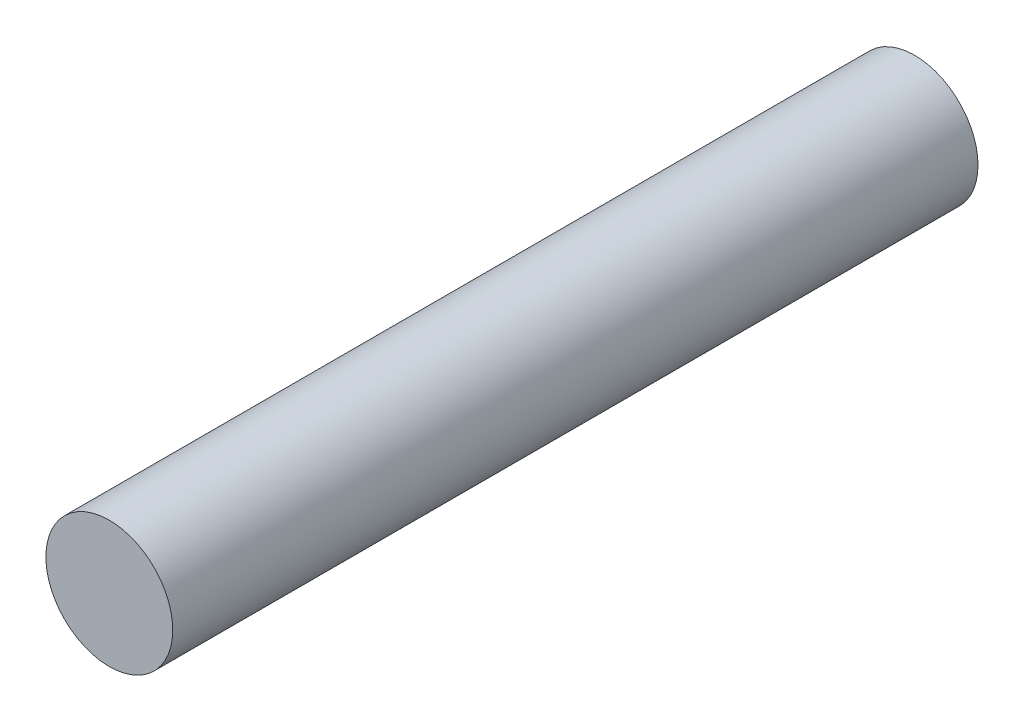
ISO-10303-21;
HEADER;
FILE_DESCRIPTION(('STEP AP214'),'2;1');
FILE_NAME('part.step','',(''),(''),'','','');
FILE_SCHEMA(('AUTOMOTIVE_DESIGN { 1 0 10303 214 1 1 1 1 }'));
ENDSEC;
DATA;
#1=APPLICATION_CONTEXT('core data for automotive mechanical design processes');
#2=APPLICATION_PROTOCOL_DEFINITION('international standard','automotive_design',2000,#1);
#3=PRODUCT_CONTEXT('',#1,'mechanical');
#4=PRODUCT('Part','Part','',(#3));
#5=PRODUCT_RELATED_PRODUCT_CATEGORY('part','',(#4));
#6=PRODUCT_DEFINITION_FORMATION('','',#4);
#7=PRODUCT_DEFINITION_CONTEXT('part definition',#1,'design');
#8=PRODUCT_DEFINITION('design','',#6,#7);
#9=PRODUCT_DEFINITION_SHAPE('','',#8);
#10=(LENGTH_UNIT() NAMED_UNIT(*) SI_UNIT(.MILLI.,.METRE.));
#11=(NAMED_UNIT(*) PLANE_ANGLE_UNIT() SI_UNIT($,.RADIAN.));
#12=(NAMED_UNIT(*) SI_UNIT($,.STERADIAN.) SOLID_ANGLE_UNIT());
#13=UNCERTAINTY_MEASURE_WITH_UNIT(LENGTH_MEASURE(1.E-05),#10,'distance_accuracy_value','');
#14=(GEOMETRIC_REPRESENTATION_CONTEXT(3) GLOBAL_UNCERTAINTY_ASSIGNED_CONTEXT((#13)) GLOBAL_UNIT_ASSIGNED_CONTEXT((#10,
#11,#12)) REPRESENTATION_CONTEXT('',''));
#15=CARTESIAN_POINT('',(0.,0.,0.));
#16=DIRECTION('',(0.,0.,1.));
#17=DIRECTION('',(1.,0.,0.));
#18=AXIS2_PLACEMENT_3D('',#15,#16,#17);
#19=CARTESIAN_POINT('',(0.,0.,254.));
#20=DIRECTION('',(0.,0.,-1.));
#21=DIRECTION('',(-1.,0.,0.));
#22=AXIS2_PLACEMENT_3D('',#19,#20,#21);
#23=CYLINDRICAL_SURFACE('',#22,20.);
#24=CARTESIAN_POINT('',(0.,0.,254.));
#25=DIRECTION('',(0.,0.,1.));
#26=DIRECTION('',(1.,0.,0.));
#27=AXIS2_PLACEMENT_3D('',#24,#25,#26);
#28=CIRCLE('',#27,20.);
#29=CARTESIAN_POINT('',(20.,0.,254.));
#30=VERTEX_POINT('',#29);
#31=EDGE_CURVE('E10',#30,#30,#28,.T.);
#32=ORIENTED_EDGE('',*,*,#31,.F.);
#33=EDGE_LOOP('',(#32));
#34=FACE_BOUND('',#33,.T.);
#35=CARTESIAN_POINT('',(0.,0.,0.));
#36=DIRECTION('',(0.,0.,1.));
#37=DIRECTION('',(1.,0.,0.));
#38=AXIS2_PLACEMENT_3D('',#35,#36,#37);
#39=CIRCLE('',#38,20.);
#40=CARTESIAN_POINT('',(20.,0.,0.));
#41=VERTEX_POINT('',#40);
#42=EDGE_CURVE('E40',#41,#41,#39,.T.);
#43=ORIENTED_EDGE('',*,*,#42,.T.);
#44=EDGE_LOOP('',(#43));
#45=FACE_BOUND('',#44,.T.);
#46=ADVANCED_FACE('F37',(#34,#45),#23,.T.);
#47=CARTESIAN_POINT('',(0.,0.,254.));
#48=DIRECTION('',(0.,0.,1.));
#49=DIRECTION('',(1.,0.,0.));
#50=AXIS2_PLACEMENT_3D('',#47,#48,#49);
#51=PLANE('',#50);
#52=ORIENTED_EDGE('',*,*,#31,.T.);
#53=EDGE_LOOP('',(#52));
#54=FACE_BOUND('',#53,.T.);
#55=ADVANCED_FACE('F54',(#54),#51,.T.);
#56=CARTESIAN_POINT('',(0.,0.,0.));
#57=DIRECTION('',(0.,0.,1.));
#58=DIRECTION('',(1.,0.,0.));
#59=AXIS2_PLACEMENT_3D('',#56,#57,#58);
#60=PLANE('',#59);
#61=ORIENTED_EDGE('',*,*,#42,.F.);
#62=EDGE_LOOP('',(#61));
#63=FACE_BOUND('',#62,.T.);
#64=ADVANCED_FACE('F52',(#63),#60,.F.);
#65=CLOSED_SHELL('',(#46,#55,#64));
#66=MANIFOLD_SOLID_BREP('B2',#65);
#67=ADVANCED_BREP_SHAPE_REPRESENTATION('',(#18,#66),#14);
#68=SHAPE_DEFINITION_REPRESENTATION(#9,#67);
ENDSEC;
END-ISO-10303-21;
